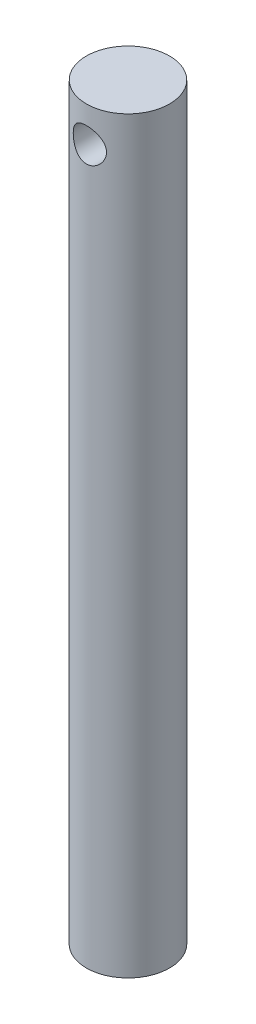
ISO-10303-21;
HEADER;
FILE_DESCRIPTION(('STEP AP214'),'2;1');
FILE_NAME('part.step','',(''),(''),'','','');
FILE_SCHEMA(('AUTOMOTIVE_DESIGN { 1 0 10303 214 1 1 1 1 }'));
ENDSEC;
DATA;
#1=APPLICATION_CONTEXT('core data for automotive mechanical design processes');
#2=APPLICATION_PROTOCOL_DEFINITION('international standard','automotive_design',2000,#1);
#3=PRODUCT_CONTEXT('',#1,'mechanical');
#4=PRODUCT('Part','Part','',(#3));
#5=PRODUCT_RELATED_PRODUCT_CATEGORY('part','',(#4));
#6=PRODUCT_DEFINITION_FORMATION('','',#4);
#7=PRODUCT_DEFINITION_CONTEXT('part definition',#1,'design');
#8=PRODUCT_DEFINITION('design','',#6,#7);
#9=PRODUCT_DEFINITION_SHAPE('','',#8);
#10=(LENGTH_UNIT() NAMED_UNIT(*) SI_UNIT(.MILLI.,.METRE.));
#11=(NAMED_UNIT(*) PLANE_ANGLE_UNIT() SI_UNIT($,.RADIAN.));
#12=(NAMED_UNIT(*) SI_UNIT($,.STERADIAN.) SOLID_ANGLE_UNIT());
#13=UNCERTAINTY_MEASURE_WITH_UNIT(LENGTH_MEASURE(1.E-05),#10,'distance_accuracy_value','');
#14=(GEOMETRIC_REPRESENTATION_CONTEXT(3) GLOBAL_UNCERTAINTY_ASSIGNED_CONTEXT((#13)) GLOBAL_UNIT_ASSIGNED_CONTEXT((#10,
#11,#12)) REPRESENTATION_CONTEXT('',''));
#15=CARTESIAN_POINT('',(0.,0.,0.));
#16=DIRECTION('',(0.,0.,1.));
#17=DIRECTION('',(1.,0.,0.));
#18=AXIS2_PLACEMENT_3D('',#15,#16,#17);
#19=CARTESIAN_POINT('',(0.,160.,0.));
#20=DIRECTION('',(0.,-1.,0.));
#21=DIRECTION('',(0.,0.,-1.));
#22=AXIS2_PLACEMENT_3D('',#19,#20,#21);
#23=CYLINDRICAL_SURFACE('',#22,10.);
#24=CARTESIAN_POINT('',(0.,155.5,-10.));
#25=CARTESIAN_POINT('',(-0.107549581345536,155.499998425067,-9.99999886871264));
#26=CARTESIAN_POINT('',(-0.215132147940361,155.49565632892,-9.99825999367799));
#27=CARTESIAN_POINT('',(-0.429535200549547,155.478326617216,-9.99134740691108));
#28=CARTESIAN_POINT('',(-0.536355162703299,155.465333546597,-9.98617152790588));
#29=CARTESIAN_POINT('',(-0.748635856497414,155.430791965449,-9.97250573560117));
#30=CARTESIAN_POINT('',(-0.854093134440867,155.40922494538,-9.96400865312143));
#31=CARTESIAN_POINT('',(-1.06266761114009,155.357758269563,-9.94393017211574));
#32=CARTESIAN_POINT('',(-1.16578384227259,155.327855233745,-9.932347522545));
#33=CARTESIAN_POINT('',(-1.46979509681069,155.226277191284,-9.89349112162205));
#34=CARTESIAN_POINT('',(-1.66629107461992,155.142578180994,-9.86204458846134));
#35=CARTESIAN_POINT('',(-2.04217417878101,154.94595378265,-9.79113035538708));
#36=CARTESIAN_POINT('',(-2.22156721456798,154.833038539885,-9.75166544086263));
#37=CARTESIAN_POINT('',(-2.56699339938209,154.575531245478,-9.66661825353092));
#38=CARTESIAN_POINT('',(-2.73212223266509,154.429787289424,-9.62084608086599));
#39=CARTESIAN_POINT('',(-3.03635232313264,154.113199390848,-9.52921139577231));
#40=CARTESIAN_POINT('',(-3.17544084661153,153.942343240983,-9.48334885017047));
#41=CARTESIAN_POINT('',(-3.42974847409894,153.571144031434,-9.39445587657958));
#42=CARTESIAN_POINT('',(-3.54362978572887,153.369827073936,-9.35164233015934));
#43=CARTESIAN_POINT('',(-3.73550961465234,152.948927157199,-9.2766729328807));
#44=CARTESIAN_POINT('',(-3.81352517485723,152.729352932259,-9.24451202207145));
#45=CARTESIAN_POINT('',(-3.92779760260541,152.288575344314,-9.19652715590089));
#46=CARTESIAN_POINT('',(-3.96578791979826,152.067897531912,-9.18002840771385));
#47=CARTESIAN_POINT('',(-4.00434593508728,151.622730000323,-9.16328008038142));
#48=CARTESIAN_POINT('',(-4.00493203570086,151.398242209989,-9.16302251073202));
#49=CARTESIAN_POINT('',(-3.9699787321474,150.968486657777,-9.17821000534301));
#50=CARTESIAN_POINT('',(-3.93695062778272,150.762968571234,-9.19256349925666));
#51=CARTESIAN_POINT('',(-3.83989376129508,150.36068088765,-9.23352375055553));
#52=CARTESIAN_POINT('',(-3.77585958980135,150.163912823694,-9.26013264599921));
#53=CARTESIAN_POINT('',(-3.6173894649114,149.779964327708,-9.32318970221162));
#54=CARTESIAN_POINT('',(-3.52235972457939,149.593061521918,-9.35982758573424));
#55=CARTESIAN_POINT('',(-3.30501292151569,149.23716836725,-9.43876232767927));
#56=CARTESIAN_POINT('',(-3.1826856102159,149.068184781187,-9.48106130910411));
#57=CARTESIAN_POINT('',(-2.90310119889357,148.739180542404,-9.57053473488081));
#58=CARTESIAN_POINT('',(-2.74387492593717,148.58086254111,-9.61783329953252));
#59=CARTESIAN_POINT('',(-2.40062885486448,148.292631043994,-9.70919649915615));
#60=CARTESIAN_POINT('',(-2.21660413066997,148.162723205179,-9.75326048890393));
#61=CARTESIAN_POINT('',(-1.82415530521054,147.932765105169,-9.83429362529359));
#62=CARTESIAN_POINT('',(-1.61532098269265,147.833355437606,-9.87110540190899));
#63=CARTESIAN_POINT('',(-1.18204753096606,147.671664277844,-9.93229656657448));
#64=CARTESIAN_POINT('',(-0.957616393699403,147.609363924885,-9.95668226924746));
#65=CARTESIAN_POINT('',(-0.5137917752156,147.527103409161,-9.98912279013838));
#66=CARTESIAN_POINT('',(-0.29488658797115,147.504855091493,-9.99805891667034));
#67=CARTESIAN_POINT('',(0.143690619615697,147.496573798943,-10.0013695702126));
#68=CARTESIAN_POINT('',(0.363362426448175,147.510531436905,-9.99574787164577));
#69=CARTESIAN_POINT('',(0.786865478243646,147.572583505104,-9.97115134127512));
#70=CARTESIAN_POINT('',(0.990964983549753,147.619115960703,-9.95278782691064));
#71=CARTESIAN_POINT('',(1.38827085612274,147.742871416619,-9.90518882810983));
#72=CARTESIAN_POINT('',(1.58147582045411,147.820098359335,-9.87595194712999));
#73=CARTESIAN_POINT('',(1.95815757162883,148.005569879362,-9.80833189541687));
#74=CARTESIAN_POINT('',(2.14115604549353,148.114690944095,-9.76969631959847));
#75=CARTESIAN_POINT('',(2.4868871825104,148.359880647803,-9.68746729490809));
#76=CARTESIAN_POINT('',(2.64961168158684,148.495960085814,-9.64387186219643));
#77=CARTESIAN_POINT('',(2.96144608598877,148.801740025933,-9.55290235277181));
#78=CARTESIAN_POINT('',(3.10894786734724,148.973067083141,-9.50546882853788));
#79=CARTESIAN_POINT('',(3.37350239509233,149.33888016589,-9.41483345830581));
#80=CARTESIAN_POINT('',(3.4905501236659,149.533370000199,-9.37163231039243));
#81=CARTESIAN_POINT('',(3.69161500286277,149.942923389673,-9.2942859982933));
#82=CARTESIAN_POINT('',(3.77530118531766,150.158168000243,-9.26023261821741));
#83=CARTESIAN_POINT('',(3.90459244315908,150.601467301613,-9.20647346903737));
#84=CARTESIAN_POINT('',(3.95022562452797,150.829512404842,-9.18675711197461));
#85=CARTESIAN_POINT('',(3.99943122157416,151.274255809844,-9.16543518780389));
#86=CARTESIAN_POINT('',(4.0057941177721,151.490589701895,-9.16262842667612));
#87=CARTESIAN_POINT('',(3.98360636538274,151.921089692721,-9.17229671415009));
#88=CARTESIAN_POINT('',(3.9550601501471,152.135256063282,-9.18476982225497));
#89=CARTESIAN_POINT('',(3.86614256488129,152.54666446089,-9.2225330048627));
#90=CARTESIAN_POINT('',(3.80707437387707,152.744240846221,-9.24729672182969));
#91=CARTESIAN_POINT('',(3.66001151041638,153.12675696179,-9.30647993934965));
#92=CARTESIAN_POINT('',(3.57200884934551,153.311693185111,-9.34090210615104));
#93=CARTESIAN_POINT('',(3.36374310804134,153.675220410709,-9.4179725282647));
#94=CARTESIAN_POINT('',(3.24192140926544,153.852841830688,-9.46097893410836));
#95=CARTESIAN_POINT('',(2.97179350239178,154.185982142625,-9.54927479921251));
#96=CARTESIAN_POINT('',(2.82347931168582,154.34149434729,-9.59456494363941));
#97=CARTESIAN_POINT('',(2.49297412446701,154.636423592531,-9.68587647140964));
#98=CARTESIAN_POINT('',(2.30921017071957,154.774143383982,-9.73175488236392));
#99=CARTESIAN_POINT('',(2.01716584575535,154.956048108937,-9.7949502762577));
#100=CARTESIAN_POINT('',(1.91699501972427,155.012607063853,-9.81509269692654));
#101=CARTESIAN_POINT('',(1.71180110982483,155.117037995405,-9.85294835133019));
#102=CARTESIAN_POINT('',(1.60678027559744,155.164913949808,-9.87066269647665));
#103=CARTESIAN_POINT('',(1.3945464690433,155.250747984685,-9.9028559935491));
#104=CARTESIAN_POINT('',(1.28740777135873,155.288870154747,-9.91738778532477));
#105=CARTESIAN_POINT('',(1.06995577523385,155.355921347721,-9.94319722915714));
#106=CARTESIAN_POINT('',(0.959643983352634,155.38485465735,-9.95447639837582));
#107=CARTESIAN_POINT('',(0.736945215856852,155.433174836149,-9.97343330649399));
#108=CARTESIAN_POINT('',(0.624564263591296,155.452585911645,-9.98112017494336));
#109=CARTESIAN_POINT('',(0.398419132407617,155.481738570666,-9.99270031578293));
#110=CARTESIAN_POINT('',(0.284655994966367,155.491487026834,-9.99659628445551));
#111=CARTESIAN_POINT('',(0.113830463425501,155.498785895573,-9.99951445883957));
#112=CARTESIAN_POINT('',(0.0569198512645344,155.500000833522,-10.0000005987258));
#113=CARTESIAN_POINT('',(0.,155.5,-10.));
#114=B_SPLINE_CURVE_WITH_KNOTS('',3,(#24,#25,#26,#27,#28,#29,#30,#31,#32,#33,#34,#35,#36,#37,
#38,#39,#40,#41,#42,#43,#44,#45,#46,#47,#48,#49,#50,#51,#52,#53,#54,#55,#56,#57,#58,#59,#60,#61,
#62,#63,#64,#65,#66,#67,#68,#69,#70,#71,#72,#73,#74,#75,#76,#77,#78,#79,#80,#81,#82,#83,#84,#85,
#86,#87,#88,#89,#90,#91,#92,#93,#94,#95,#96,#97,#98,#99,#100,#101,#102,#103,#104,#105,#106,#107,
#108,#109,#110,#111,#112,#113),.UNSPECIFIED.,.T.,.F.,(4,2,2,2,2,2,2,2,2,2,2,2,2,2,2,2,2,2,2,2,2,
2,2,2,2,2,2,2,2,2,2,2,2,2,2,2,2,2,2,2,2,2,2,2,4),(0.,0.322603993422153,0.645411604786485,
0.968919914471228,1.29255959093094,1.93701523385824,2.58124739027476,3.25313995292304,
3.9253602176033,4.62749749529942,5.32930078128045,5.99927442509166,6.66891844572485,
7.29195888698821,7.91510806412269,8.55097484497806,9.1870807577654,9.8723593027329,
10.5577741757964,11.2567305822579,11.9553314412776,12.6125760095619,13.2696501904034,
13.8972014302891,14.5248332988777,15.171662586967,15.8187515089811,16.50856181149,
17.1984856998767,17.8950932218183,18.5911857719204,19.2371857868567,19.8831037702626,
20.5034786899771,21.124025035105,21.7801016801356,22.4363763459696,23.1352007896785,
23.4851924266231,23.8350233218042,24.1785111324565,24.52183846562,24.8642884495951,
25.2064946871486,25.3772305569977),.UNSPECIFIED.);
#115=CARTESIAN_POINT('',(0.,155.5,-10.));
#116=VERTEX_POINT('',#115);
#117=EDGE_CURVE('E34',#116,#116,#114,.T.);
#118=ORIENTED_EDGE('',*,*,#117,.T.);
#119=EDGE_LOOP('',(#118));
#120=FACE_BOUND('',#119,.T.);
#121=CARTESIAN_POINT('',(4.,151.5,9.16515138991169));
#122=CARTESIAN_POINT('',(3.99999917996685,151.392822503216,9.16515220722508));
#123=CARTESIAN_POINT('',(3.99568627578832,151.285612140205,9.16703782704588));
#124=CARTESIAN_POINT('',(3.97847804504316,151.071967905829,9.17451890581267));
#125=CARTESIAN_POINT('',(3.965577465543,150.965534550055,9.18011663538446));
#126=CARTESIAN_POINT('',(3.9312935770878,150.754064046644,9.19485078616074));
#127=CARTESIAN_POINT('',(3.90989336356572,150.649030115151,9.20399425848326));
#128=CARTESIAN_POINT('',(3.8588393720858,150.44131240281,9.2255144619826));
#129=CARTESIAN_POINT('',(3.82918216740129,150.338629616898,9.23789253541712));
#130=CARTESIAN_POINT('',(3.72849978450445,150.036010273371,9.27920231487636));
#131=CARTESIAN_POINT('',(3.64559228099563,149.840462079036,9.31238810193525));
#132=CARTESIAN_POINT('',(3.45083256453889,149.466198731327,9.38629512671437));
#133=CARTESIAN_POINT('',(3.33898667159604,149.287479914109,9.42701471853534));
#134=CARTESIAN_POINT('',(3.08264624953203,148.941488186399,9.51401677460927));
#135=CARTESIAN_POINT('',(2.93675933272145,148.775289566711,9.56047821792022));
#136=CARTESIAN_POINT('',(2.61941759406606,148.468939591958,9.65224928088017));
#137=CARTESIAN_POINT('',(2.44795387495429,148.328797339245,9.69755849326326));
#138=CARTESIAN_POINT('',(2.07601279575006,148.073187890163,9.78406811808173));
#139=CARTESIAN_POINT('',(1.87465797803876,147.958911580031,9.82503606295845));
#140=CARTESIAN_POINT('',(1.45365059895516,147.766312680323,9.89607856333948));
#141=CARTESIAN_POINT('',(1.23400552632836,147.687975460567,9.92615755049622));
#142=CARTESIAN_POINT('',(0.793932865332447,147.573317072677,9.97076649749865));
#143=CARTESIAN_POINT('',(0.574057972725541,147.535145384002,9.98597873479394));
#144=CARTESIAN_POINT('',(0.130532654160172,147.495943016499,10.001606214367));
#145=CARTESIAN_POINT('',(-0.093116332463108,147.494898484956,10.0020269755724));
#146=CARTESIAN_POINT('',(-0.52446498866392,147.528965542546,9.98843925626006));
#147=CARTESIAN_POINT('',(-0.732354905542445,147.562049546297,9.97523993538891));
#148=CARTESIAN_POINT('',(-1.13934621864229,147.659985751818,9.93698582942363));
#149=CARTESIAN_POINT('',(-1.33844696883603,147.724840284584,9.91193017443785));
#150=CARTESIAN_POINT('',(-1.72579587696675,147.885272965972,9.85193648913816));
#151=CARTESIAN_POINT('',(-1.91383524674319,147.981299429689,9.81685520932147));
#152=CARTESIAN_POINT('',(-2.27161630149722,148.20093001378,9.7402917036085));
#153=CARTESIAN_POINT('',(-2.44135168543994,148.324543586184,9.69880728534381));
#154=CARTESIAN_POINT('',(-2.76953765597605,148.605298271905,9.61043274352157));
#155=CARTESIAN_POINT('',(-2.92651569053149,148.76410778515,9.56336653023493));
#156=CARTESIAN_POINT('',(-3.21221483078646,149.105981143659,9.47123321946549));
#157=CARTESIAN_POINT('',(-3.34092668757428,149.28905289639,9.42616678016159));
#158=CARTESIAN_POINT('',(-3.56980837743822,149.680838044749,9.3419379481804));
#159=CARTESIAN_POINT('',(-3.66906930327243,149.890129660678,9.30297828115414));
#160=CARTESIAN_POINT('',(-3.830352519733,150.324430980624,9.23775180688171));
#161=CARTESIAN_POINT('',(-3.89239899675599,150.549430369453,9.21147675782622));
#162=CARTESIAN_POINT('',(-3.97390989770977,150.994071554935,9.17659519405432));
#163=CARTESIAN_POINT('',(-3.99574419362908,151.213200894257,9.16700732912275));
#164=CARTESIAN_POINT('',(-4.00312265288578,151.652154415519,9.16378995738077));
#165=CARTESIAN_POINT('',(-3.98867782118257,151.871978366551,9.17015561120724));
#166=CARTESIAN_POINT('',(-3.92606578958006,152.292917869914,9.19712088718227));
#167=CARTESIAN_POINT('',(-3.87986612404772,152.4943858748,9.21688915596603));
#168=CARTESIAN_POINT('',(-3.75760837382175,152.886576809571,9.2674010205468));
#169=CARTESIAN_POINT('',(-3.68154366860459,153.077297346215,9.29814704977195));
#170=CARTESIAN_POINT('',(-3.49827127896311,153.451204715591,9.36867563720203));
#171=CARTESIAN_POINT('',(-3.38992573652915,153.633772377387,9.40877409278357));
#172=CARTESIAN_POINT('',(-3.1463304488838,153.978965974885,9.49300770315587));
#173=CARTESIAN_POINT('',(-3.01106974696435,154.141583745598,9.5371444979208));
#174=CARTESIAN_POINT('',(-2.70568842336055,154.454746817191,9.62841831942843));
#175=CARTESIAN_POINT('',(-2.53373085888854,154.603513130555,9.67553614570507));
#176=CARTESIAN_POINT('',(-2.16616726673935,154.870354153248,9.76439589135024));
#177=CARTESIAN_POINT('',(-1.97056027694194,154.988427613297,9.80613759186121));
#178=CARTESIAN_POINT('',(-1.56055986799734,155.190095252819,9.87967431800929));
#179=CARTESIAN_POINT('',(-1.34617096196502,155.273697687947,9.9114717248188));
#180=CARTESIAN_POINT('',(-0.904787181861583,155.403097705199,9.96145426937248));
#181=CARTESIAN_POINT('',(-0.677799220674814,155.448915804313,9.97964679410119));
#182=CARTESIAN_POINT('',(-0.23363302061199,155.499009401911,9.99958016425668));
#183=CARTESIAN_POINT('',(-0.0167809848943206,155.505800252077,10.0023169350655));
#184=CARTESIAN_POINT('',(0.414867671174708,155.48428904628,9.99372084740381));
#185=CARTESIAN_POINT('',(0.629664597702876,155.455992302479,9.98239011871255));
#186=CARTESIAN_POINT('',(1.04434180494579,155.366906405787,9.94743026789158));
#187=CARTESIAN_POINT('',(1.24447761316988,155.307142043495,9.92418961491739));
#188=CARTESIAN_POINT('',(1.63184470564402,155.157894455242,9.86789895440956));
#189=CARTESIAN_POINT('',(1.8190736020911,155.068405747944,9.83484713776136));
#190=CARTESIAN_POINT('',(2.18440609879392,154.857793352432,9.76036189588764));
#191=CARTESIAN_POINT('',(2.36174083104879,154.735446455904,9.71862262764552));
#192=CARTESIAN_POINT('',(2.69410799958837,154.464423916364,9.63178803063432));
#193=CARTESIAN_POINT('',(2.84913115669899,154.315737375961,9.58669131729773));
#194=CARTESIAN_POINT('',(3.1424027582614,153.985365761134,9.49475540255924));
#195=CARTESIAN_POINT('',(3.27901865020171,153.802207701298,9.4479811565371));
#196=CARTESIAN_POINT('',(3.5196940249722,153.414130278752,9.3609929250149));
#197=CARTESIAN_POINT('',(3.62374968011082,153.209208361334,9.32077971107738));
#198=CARTESIAN_POINT('',(3.78798515690827,152.80187605622,9.25517900642369));
#199=CARTESIAN_POINT('',(3.85126569346865,152.600892324054,9.22878451494604));
#200=CARTESIAN_POINT('',(3.92194632104983,152.293361040209,9.1988556584339));
#201=CARTESIAN_POINT('',(3.94146052144918,152.189926964106,9.19049270633767));
#202=CARTESIAN_POINT('',(3.97228850679683,151.981643070389,9.17721200341612));
#203=CARTESIAN_POINT('',(3.98360705155155,151.876794110604,9.17229225293171));
#204=CARTESIAN_POINT('',(3.99384232103283,151.726449408648,9.16783675423417));
#205=CARTESIAN_POINT('',(3.99615058414993,151.681200169678,9.16683059815414));
#206=CARTESIAN_POINT('',(3.99922965337524,151.590635915785,9.16548771864777));
#207=CARTESIAN_POINT('',(4.00000034675784,151.545320896284,9.16515104430392));
#208=CARTESIAN_POINT('',(4.,151.5,9.16515138991169));
#209=B_SPLINE_CURVE_WITH_KNOTS('',3,(#121,#122,#123,#124,#125,#126,#127,#128,#129,#130,#131,
#132,#133,#134,#135,#136,#137,#138,#139,#140,#141,#142,#143,#144,#145,#146,#147,#148,#149,#150,
#151,#152,#153,#154,#155,#156,#157,#158,#159,#160,#161,#162,#163,#164,#165,#166,#167,#168,#169,
#170,#171,#172,#173,#174,#175,#176,#177,#178,#179,#180,#181,#182,#183,#184,#185,#186,#187,#188,
#189,#190,#191,#192,#193,#194,#195,#196,#197,#198,#199,#200,#201,#202,#203,#204,#205,#206,#207,
#208),.UNSPECIFIED.,.T.,.F.,(4,2,2,2,2,2,2,2,2,2,2,2,2,2,2,2,2,2,2,2,2,2,2,2,2,2,2,2,2,2,2,2,2,
2,2,2,2,2,2,2,2,2,2,4),(0.,0.321486083338372,0.643168995111178,0.965494918272688,
1.28795480954363,1.92974178448592,2.57138871437638,3.24631250358765,3.92147162486597,
4.62325351972768,5.32474947728872,5.9922837956428,6.65956904401257,7.28937303450518,
7.91922324048032,8.5585661425971,9.19812843669976,9.87968101952624,10.5614562804417,
11.2624893122443,11.9630662339012,12.6208430883875,13.2784204360579,13.898545099602,
14.5188073109319,15.1642232309531,15.8099024284161,16.5032748228387,17.1966754349541,
17.8899098841554,18.5827676569818,19.2304209330182,19.8779761681511,20.5056400267662,
21.1334196944708,21.7889411606976,22.4447344691832,23.1411252036114,23.8375977730829,
24.4715333542806,24.7879924179096,25.1042675432748,25.2402006430819,25.3761437083411),.UNSPECIFIED.);
#210=CARTESIAN_POINT('',(4.,151.5,9.16515138991169));
#211=VERTEX_POINT('',#210);
#212=EDGE_CURVE('E47',#211,#211,#209,.T.);
#213=ORIENTED_EDGE('',*,*,#212,.T.);
#214=EDGE_LOOP('',(#213));
#215=FACE_BOUND('',#214,.T.);
#216=CARTESIAN_POINT('',(0.,160.,0.));
#217=DIRECTION('',(0.,1.,0.));
#218=DIRECTION('',(0.,0.,1.));
#219=AXIS2_PLACEMENT_3D('',#216,#217,#218);
#220=CIRCLE('',#219,10.);
#221=CARTESIAN_POINT('',(0.,160.,10.));
#222=VERTEX_POINT('',#221);
#223=EDGE_CURVE('E10',#222,#222,#220,.T.);
#224=ORIENTED_EDGE('',*,*,#223,.F.);
#225=EDGE_LOOP('',(#224));
#226=FACE_BOUND('',#225,.T.);
#227=CARTESIAN_POINT('',(0.,-20.,0.));
#228=DIRECTION('',(0.,1.,0.));
#229=DIRECTION('',(0.,0.,1.));
#230=AXIS2_PLACEMENT_3D('',#227,#228,#229);
#231=CIRCLE('',#230,10.);
#232=CARTESIAN_POINT('',(0.,-20.,10.));
#233=VERTEX_POINT('',#232);
#234=EDGE_CURVE('E41',#233,#233,#231,.T.);
#235=ORIENTED_EDGE('',*,*,#234,.T.);
#236=EDGE_LOOP('',(#235));
#237=FACE_BOUND('',#236,.T.);
#238=ADVANCED_FACE('F30',(#120,#215,#226,#237),#23,.T.);
#239=CARTESIAN_POINT('',(0.,160.,0.));
#240=DIRECTION('',(0.,1.,0.));
#241=DIRECTION('',(0.,0.,1.));
#242=AXIS2_PLACEMENT_3D('',#239,#240,#241);
#243=PLANE('',#242);
#244=ORIENTED_EDGE('',*,*,#223,.T.);
#245=EDGE_LOOP('',(#244));
#246=FACE_BOUND('',#245,.T.);
#247=ADVANCED_FACE('F57',(#246),#243,.T.);
#248=CARTESIAN_POINT('',(0.,-20.,0.));
#249=DIRECTION('',(0.,1.,0.));
#250=DIRECTION('',(0.,0.,1.));
#251=AXIS2_PLACEMENT_3D('',#248,#249,#250);
#252=PLANE('',#251);
#253=ORIENTED_EDGE('',*,*,#234,.F.);
#254=EDGE_LOOP('',(#253));
#255=FACE_BOUND('',#254,.T.);
#256=ADVANCED_FACE('F55',(#255),#252,.F.);
#257=CARTESIAN_POINT('',(0.,151.5,-25.));
#258=DIRECTION('',(0.,0.,1.));
#259=DIRECTION('',(1.,0.,0.));
#260=AXIS2_PLACEMENT_3D('',#257,#258,#259);
#261=CYLINDRICAL_SURFACE('',#260,4.);
#262=ORIENTED_EDGE('',*,*,#212,.F.);
#263=EDGE_LOOP('',(#262));
#264=FACE_BOUND('',#263,.T.);
#265=ORIENTED_EDGE('',*,*,#117,.F.);
#266=EDGE_LOOP('',(#265));
#267=FACE_BOUND('',#266,.T.);
#268=ADVANCED_FACE('F51',(#264,#267),#261,.F.);
#269=CLOSED_SHELL('',(#238,#247,#256,#268));
#270=MANIFOLD_SOLID_BREP('B2',#269);
#271=ADVANCED_BREP_SHAPE_REPRESENTATION('',(#18,#270),#14);
#272=SHAPE_DEFINITION_REPRESENTATION(#9,#271);
ENDSEC;
END-ISO-10303-21;
